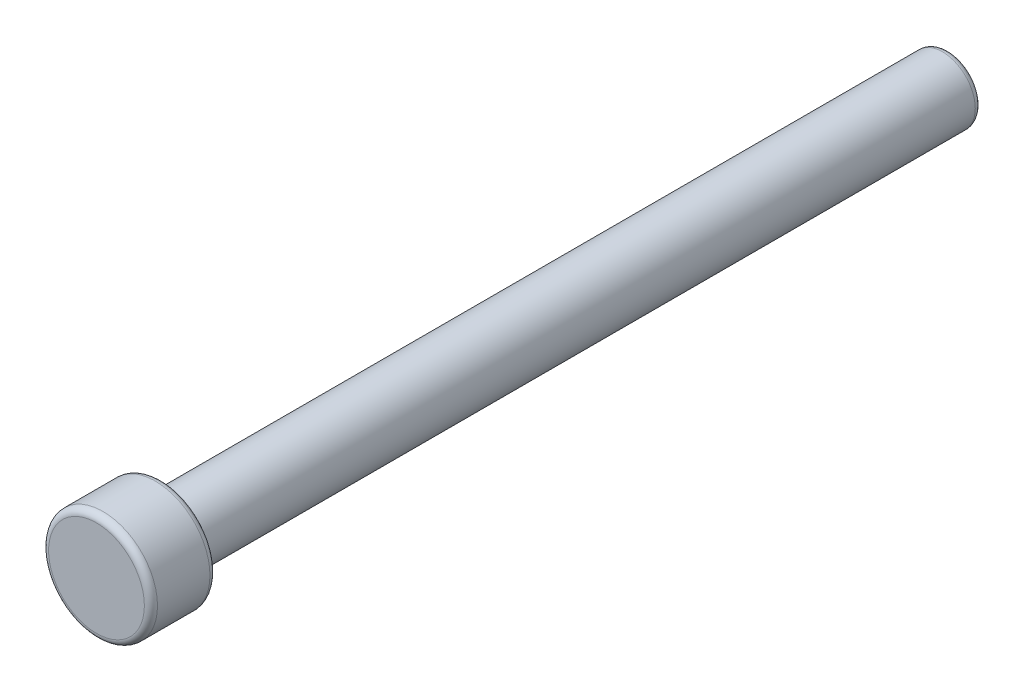
ISO-10303-21;
HEADER;
FILE_DESCRIPTION(('STEP AP214'),'2;1');
FILE_NAME('part.step','',(''),(''),'','','');
FILE_SCHEMA(('AUTOMOTIVE_DESIGN { 1 0 10303 214 1 1 1 1 }'));
ENDSEC;
DATA;
#1=APPLICATION_CONTEXT('core data for automotive mechanical design processes');
#2=APPLICATION_PROTOCOL_DEFINITION('international standard','automotive_design',2000,#1);
#3=PRODUCT_CONTEXT('',#1,'mechanical');
#4=PRODUCT('Part','Part','',(#3));
#5=PRODUCT_RELATED_PRODUCT_CATEGORY('part','',(#4));
#6=PRODUCT_DEFINITION_FORMATION('','',#4);
#7=PRODUCT_DEFINITION_CONTEXT('part definition',#1,'design');
#8=PRODUCT_DEFINITION('design','',#6,#7);
#9=PRODUCT_DEFINITION_SHAPE('','',#8);
#10=(LENGTH_UNIT() NAMED_UNIT(*) SI_UNIT(.MILLI.,.METRE.));
#11=(NAMED_UNIT(*) PLANE_ANGLE_UNIT() SI_UNIT($,.RADIAN.));
#12=(NAMED_UNIT(*) SI_UNIT($,.STERADIAN.) SOLID_ANGLE_UNIT());
#13=UNCERTAINTY_MEASURE_WITH_UNIT(LENGTH_MEASURE(1.E-05),#10,'distance_accuracy_value','');
#14=(GEOMETRIC_REPRESENTATION_CONTEXT(3) GLOBAL_UNCERTAINTY_ASSIGNED_CONTEXT((#13)) GLOBAL_UNIT_ASSIGNED_CONTEXT((#10,
#11,#12)) REPRESENTATION_CONTEXT('',''));
#15=CARTESIAN_POINT('',(0.,0.,0.));
#16=DIRECTION('',(0.,0.,1.));
#17=DIRECTION('',(1.,0.,0.));
#18=AXIS2_PLACEMENT_3D('',#15,#16,#17);
#19=CARTESIAN_POINT('',(0.,0.,60.));
#20=DIRECTION('',(0.,0.,-1.));
#21=DIRECTION('',(-1.,0.,0.));
#22=AXIS2_PLACEMENT_3D('',#19,#20,#21);
#23=CYLINDRICAL_SURFACE('',#22,2.5);
#24=CARTESIAN_POINT('',(0.,0.,59.5));
#25=DIRECTION('',(0.,0.,1.));
#26=DIRECTION('',(1.,0.,0.));
#27=AXIS2_PLACEMENT_3D('',#24,#25,#26);
#28=CIRCLE('',#27,2.5);
#29=CARTESIAN_POINT('',(2.5,0.,59.5));
#30=VERTEX_POINT('',#29);
#31=EDGE_CURVE('E64',#30,#30,#28,.F.);
#32=ORIENTED_EDGE('',*,*,#31,.T.);
#33=EDGE_LOOP('',(#32));
#34=FACE_BOUND('',#33,.T.);
#35=CARTESIAN_POINT('',(0.,0.,0.5));
#36=DIRECTION('',(0.,0.,1.));
#37=DIRECTION('',(1.,0.,0.));
#38=AXIS2_PLACEMENT_3D('',#35,#36,#37);
#39=CIRCLE('',#38,2.5);
#40=CARTESIAN_POINT('',(2.5,0.,0.5));
#41=VERTEX_POINT('',#40);
#42=EDGE_CURVE('E68',#41,#41,#39,.T.);
#43=ORIENTED_EDGE('',*,*,#42,.T.);
#44=EDGE_LOOP('',(#43));
#45=FACE_BOUND('',#44,.T.);
#46=ADVANCED_FACE('F40',(#34,#45),#23,.T.);
#47=CARTESIAN_POINT('',(0.,0.,0.));
#48=DIRECTION('',(0.,0.,1.));
#49=DIRECTION('',(1.,0.,0.));
#50=AXIS2_PLACEMENT_3D('',#47,#48,#49);
#51=PLANE('',#50);
#52=CARTESIAN_POINT('',(0.,0.,0.));
#53=DIRECTION('',(0.,0.,1.));
#54=DIRECTION('',(1.,0.,0.));
#55=AXIS2_PLACEMENT_3D('',#52,#53,#54);
#56=CIRCLE('',#55,2.);
#57=CARTESIAN_POINT('',(2.,0.,0.));
#58=VERTEX_POINT('',#57);
#59=EDGE_CURVE('E58',#58,#58,#56,.F.);
#60=ORIENTED_EDGE('',*,*,#59,.T.);
#61=EDGE_LOOP('',(#60));
#62=FACE_BOUND('',#61,.T.);
#63=ADVANCED_FACE('F92',(#62),#51,.F.);
#64=CARTESIAN_POINT('',(0.,0.,65.));
#65=DIRECTION('',(0.,0.,-1.));
#66=DIRECTION('',(-1.,0.,0.));
#67=AXIS2_PLACEMENT_3D('',#64,#65,#66);
#68=CYLINDRICAL_SURFACE('',#67,4.15);
#69=CARTESIAN_POINT('',(0.,0.,64.5));
#70=DIRECTION('',(0.,0.,1.));
#71=DIRECTION('',(1.,0.,0.));
#72=AXIS2_PLACEMENT_3D('',#69,#70,#71);
#73=CIRCLE('',#72,4.15);
#74=CARTESIAN_POINT('',(4.15,0.,64.5));
#75=VERTEX_POINT('',#74);
#76=EDGE_CURVE('E10',#75,#75,#73,.F.);
#77=ORIENTED_EDGE('',*,*,#76,.T.);
#78=EDGE_LOOP('',(#77));
#79=FACE_BOUND('',#78,.T.);
#80=CARTESIAN_POINT('',(0.,0.,60.5));
#81=DIRECTION('',(0.,0.,1.));
#82=DIRECTION('',(1.,0.,0.));
#83=AXIS2_PLACEMENT_3D('',#80,#81,#82);
#84=CIRCLE('',#83,4.15);
#85=CARTESIAN_POINT('',(4.15,0.,60.5));
#86=VERTEX_POINT('',#85);
#87=EDGE_CURVE('E48',#86,#86,#84,.T.);
#88=ORIENTED_EDGE('',*,*,#87,.T.);
#89=EDGE_LOOP('',(#88));
#90=FACE_BOUND('',#89,.T.);
#91=ADVANCED_FACE('F98',(#79,#90),#68,.T.);
#92=CARTESIAN_POINT('',(0.,0.,65.));
#93=DIRECTION('',(0.,0.,1.));
#94=DIRECTION('',(1.,0.,0.));
#95=AXIS2_PLACEMENT_3D('',#92,#93,#94);
#96=PLANE('',#95);
#97=CARTESIAN_POINT('',(0.,0.,65.));
#98=DIRECTION('',(0.,0.,1.));
#99=DIRECTION('',(1.,0.,0.));
#100=AXIS2_PLACEMENT_3D('',#97,#98,#99);
#101=CIRCLE('',#100,3.65);
#102=CARTESIAN_POINT('',(3.65,0.,65.));
#103=VERTEX_POINT('',#102);
#104=EDGE_CURVE('E53',#103,#103,#101,.T.);
#105=ORIENTED_EDGE('',*,*,#104,.T.);
#106=EDGE_LOOP('',(#105));
#107=FACE_BOUND('',#106,.T.);
#108=ADVANCED_FACE('F148',(#107),#96,.T.);
#109=CARTESIAN_POINT('',(0.,0.,60.));
#110=DIRECTION('',(0.,0.,1.));
#111=DIRECTION('',(1.,0.,0.));
#112=AXIS2_PLACEMENT_3D('',#109,#110,#111);
#113=PLANE('',#112);
#114=CARTESIAN_POINT('',(0.,0.,60.));
#115=DIRECTION('',(0.,0.,1.));
#116=DIRECTION('',(1.,0.,0.));
#117=AXIS2_PLACEMENT_3D('',#114,#115,#116);
#118=CIRCLE('',#117,3.);
#119=CARTESIAN_POINT('',(3.,0.,60.));
#120=VERTEX_POINT('',#119);
#121=EDGE_CURVE('E72',#120,#120,#118,.T.);
#122=ORIENTED_EDGE('',*,*,#121,.T.);
#123=EDGE_LOOP('',(#122));
#124=FACE_BOUND('',#123,.T.);
#125=CARTESIAN_POINT('',(0.,0.,60.));
#126=DIRECTION('',(0.,0.,1.));
#127=DIRECTION('',(1.,0.,0.));
#128=AXIS2_PLACEMENT_3D('',#125,#126,#127);
#129=CIRCLE('',#128,3.65);
#130=CARTESIAN_POINT('',(3.65,0.,60.));
#131=VERTEX_POINT('',#130);
#132=EDGE_CURVE('E76',#131,#131,#129,.F.);
#133=ORIENTED_EDGE('',*,*,#132,.T.);
#134=EDGE_LOOP('',(#133));
#135=FACE_BOUND('',#134,.T.);
#136=ADVANCED_FACE('F81',(#124,#135),#113,.F.);
#137=CARTESIAN_POINT('',(0.,0.,59.5));
#138=DIRECTION('',(0.,0.,1.));
#139=DIRECTION('',(1.,0.,0.));
#140=AXIS2_PLACEMENT_3D('',#137,#138,#139);
#141=TOROIDAL_SURFACE('',#140,3.,0.5);
#142=ORIENTED_EDGE('',*,*,#31,.F.);
#143=EDGE_LOOP('',(#142));
#144=FACE_BOUND('',#143,.T.);
#145=ORIENTED_EDGE('',*,*,#121,.F.);
#146=EDGE_LOOP('',(#145));
#147=FACE_BOUND('',#146,.T.);
#148=ADVANCED_FACE('F104',(#144,#147),#141,.F.);
#149=CARTESIAN_POINT('',(0.,0.,0.5));
#150=DIRECTION('',(0.,0.,1.));
#151=DIRECTION('',(1.,0.,0.));
#152=AXIS2_PLACEMENT_3D('',#149,#150,#151);
#153=TOROIDAL_SURFACE('',#152,2.,0.5);
#154=ORIENTED_EDGE('',*,*,#59,.F.);
#155=EDGE_LOOP('',(#154));
#156=FACE_BOUND('',#155,.T.);
#157=ORIENTED_EDGE('',*,*,#42,.F.);
#158=EDGE_LOOP('',(#157));
#159=FACE_BOUND('',#158,.T.);
#160=ADVANCED_FACE('F89',(#156,#159),#153,.T.);
#161=CARTESIAN_POINT('',(0.,0.,64.5));
#162=DIRECTION('',(0.,0.,1.));
#163=DIRECTION('',(1.,0.,0.));
#164=AXIS2_PLACEMENT_3D('',#161,#162,#163);
#165=TOROIDAL_SURFACE('',#164,3.65,0.5);
#166=ORIENTED_EDGE('',*,*,#76,.F.);
#167=EDGE_LOOP('',(#166));
#168=FACE_BOUND('',#167,.T.);
#169=ORIENTED_EDGE('',*,*,#104,.F.);
#170=EDGE_LOOP('',(#169));
#171=FACE_BOUND('',#170,.T.);
#172=ADVANCED_FACE('F85',(#168,#171),#165,.T.);
#173=CARTESIAN_POINT('',(0.,0.,60.5));
#174=DIRECTION('',(0.,0.,1.));
#175=DIRECTION('',(1.,0.,0.));
#176=AXIS2_PLACEMENT_3D('',#173,#174,#175);
#177=TOROIDAL_SURFACE('',#176,3.65,0.5);
#178=ORIENTED_EDGE('',*,*,#132,.F.);
#179=EDGE_LOOP('',(#178));
#180=FACE_BOUND('',#179,.T.);
#181=ORIENTED_EDGE('',*,*,#87,.F.);
#182=EDGE_LOOP('',(#181));
#183=FACE_BOUND('',#182,.T.);
#184=ADVANCED_FACE('F42',(#180,#183),#177,.T.);
#185=CLOSED_SHELL('',(#46,#63,#91,#108,#136,#148,#160,#172,#184));
#186=MANIFOLD_SOLID_BREP('B2',#185);
#187=ADVANCED_BREP_SHAPE_REPRESENTATION('',(#18,#186),#14);
#188=SHAPE_DEFINITION_REPRESENTATION(#9,#187);
ENDSEC;
END-ISO-10303-21;
